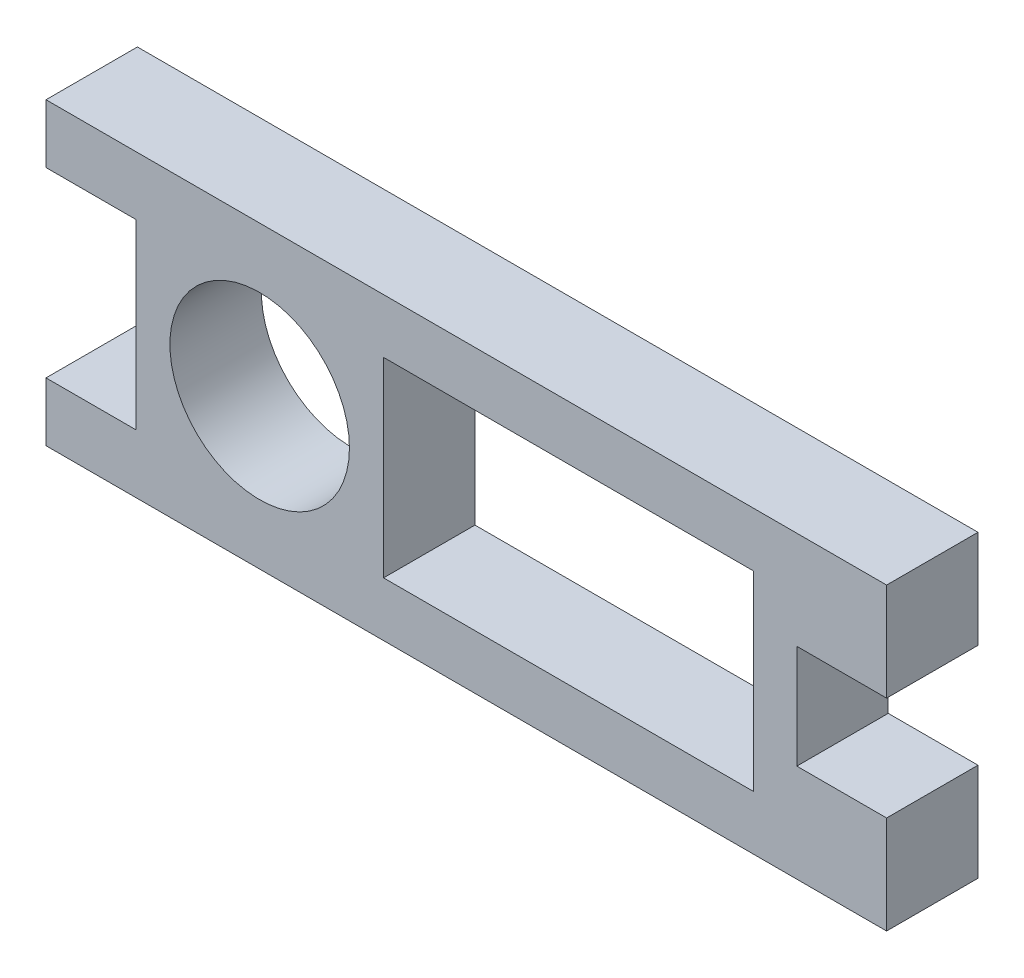
ISO-10303-21;
HEADER;
FILE_DESCRIPTION(('STEP AP214'),'2;1');
FILE_NAME('part.step','',(''),(''),'','','');
FILE_SCHEMA(('AUTOMOTIVE_DESIGN { 1 0 10303 214 1 1 1 1 }'));
ENDSEC;
DATA;
#1=APPLICATION_CONTEXT('core data for automotive mechanical design processes');
#2=APPLICATION_PROTOCOL_DEFINITION('international standard','automotive_design',2000,#1);
#3=PRODUCT_CONTEXT('',#1,'mechanical');
#4=PRODUCT('Part','Part','',(#3));
#5=PRODUCT_RELATED_PRODUCT_CATEGORY('part','',(#4));
#6=PRODUCT_DEFINITION_FORMATION('','',#4);
#7=PRODUCT_DEFINITION_CONTEXT('part definition',#1,'design');
#8=PRODUCT_DEFINITION('design','',#6,#7);
#9=PRODUCT_DEFINITION_SHAPE('','',#8);
#10=(LENGTH_UNIT() NAMED_UNIT(*) SI_UNIT(.MILLI.,.METRE.));
#11=(NAMED_UNIT(*) PLANE_ANGLE_UNIT() SI_UNIT($,.RADIAN.));
#12=(NAMED_UNIT(*) SI_UNIT($,.STERADIAN.) SOLID_ANGLE_UNIT());
#13=UNCERTAINTY_MEASURE_WITH_UNIT(LENGTH_MEASURE(1.E-05),#10,'distance_accuracy_value','');
#14=(GEOMETRIC_REPRESENTATION_CONTEXT(3) GLOBAL_UNCERTAINTY_ASSIGNED_CONTEXT((#13)) GLOBAL_UNIT_ASSIGNED_CONTEXT((#10,
#11,#12)) REPRESENTATION_CONTEXT('',''));
#15=CARTESIAN_POINT('',(0.,0.,0.));
#16=DIRECTION('',(0.,0.,1.));
#17=DIRECTION('',(1.,0.,0.));
#18=AXIS2_PLACEMENT_3D('',#15,#16,#17);
#19=CARTESIAN_POINT('',(0.,0.,5.6));
#20=DIRECTION('',(0.,0.,-1.));
#21=DIRECTION('',(-1.,0.,0.));
#22=AXIS2_PLACEMENT_3D('',#19,#20,#21);
#23=PLANE('',#22);
#24=DIRECTION('',(0.,-1.,0.));
#25=VECTOR('',#24,1.);
#26=CARTESIAN_POINT('',(717.471264670895,391.314983564074,5.6));
#27=LINE('',#26,#25);
#28=CARTESIAN_POINT('',(717.471264670895,403.014983564074,5.6));
#29=VERTEX_POINT('',#28);
#30=CARTESIAN_POINT('',(717.471264670895,391.314983564074,5.6));
#31=VERTEX_POINT('',#30);
#32=EDGE_CURVE('E148',#29,#31,#27,.T.);
#33=ORIENTED_EDGE('',*,*,#32,.F.);
#34=DIRECTION('',(-1.,0.,0.));
#35=VECTOR('',#34,1.);
#36=CARTESIAN_POINT('',(717.471264670895,403.014983564074,5.6));
#37=LINE('',#36,#35);
#38=CARTESIAN_POINT('',(740.140264670895,403.014983564074,5.6));
#39=VERTEX_POINT('',#38);
#40=EDGE_CURVE('E171',#39,#29,#37,.T.);
#41=ORIENTED_EDGE('',*,*,#40,.F.);
#42=DIRECTION('',(0.,1.,0.));
#43=VECTOR('',#42,1.);
#44=CARTESIAN_POINT('',(740.140264670895,391.314983564074,5.6));
#45=LINE('',#44,#43);
#46=CARTESIAN_POINT('',(740.140264670895,391.314983564074,5.6));
#47=VERTEX_POINT('',#46);
#48=EDGE_CURVE('E169',#47,#39,#45,.T.);
#49=ORIENTED_EDGE('',*,*,#48,.F.);
#50=DIRECTION('',(1.,0.,0.));
#51=VECTOR('',#50,1.);
#52=CARTESIAN_POINT('',(717.471264670895,391.314983564074,5.6));
#53=LINE('',#52,#51);
#54=EDGE_CURVE('E156',#31,#47,#53,.T.);
#55=ORIENTED_EDGE('',*,*,#54,.F.);
#56=EDGE_LOOP('',(#33,#41,#49,#55));
#57=FACE_BOUND('',#56,.T.);
#58=DIRECTION('',(1.,0.,0.));
#59=VECTOR('',#58,1.);
#60=CARTESIAN_POINT('',(702.290264670895,402.743983564074,5.6));
#61=LINE('',#60,#59);
#62=CARTESIAN_POINT('',(696.790264670895,402.743983564074,5.6));
#63=VERTEX_POINT('',#62);
#64=CARTESIAN_POINT('',(702.290264670895,402.743983564074,5.6));
#65=VERTEX_POINT('',#64);
#66=EDGE_CURVE('E187',#63,#65,#61,.T.);
#67=ORIENTED_EDGE('',*,*,#66,.T.);
#68=DIRECTION('',(0.,-1.,0.));
#69=VECTOR('',#68,1.);
#70=CARTESIAN_POINT('',(702.290264670895,402.743983564074,5.6));
#71=LINE('',#70,#69);
#72=CARTESIAN_POINT('',(702.290264670895,391.585983564074,5.6));
#73=VERTEX_POINT('',#72);
#74=EDGE_CURVE('E190',#65,#73,#71,.T.);
#75=ORIENTED_EDGE('',*,*,#74,.T.);
#76=DIRECTION('',(-1.,0.,0.));
#77=VECTOR('',#76,1.);
#78=CARTESIAN_POINT('',(696.790264670895,391.585983564074,5.6));
#79=LINE('',#78,#77);
#80=CARTESIAN_POINT('',(696.790264670895,391.585983564074,5.6));
#81=VERTEX_POINT('',#80);
#82=EDGE_CURVE('E193',#73,#81,#79,.T.);
#83=ORIENTED_EDGE('',*,*,#82,.T.);
#84=DIRECTION('',(0.,-1.,0.));
#85=VECTOR('',#84,1.);
#86=CARTESIAN_POINT('',(696.790264670895,387.985983564074,5.6));
#87=LINE('',#86,#85);
#88=CARTESIAN_POINT('',(696.790264670895,387.985983564074,5.6));
#89=VERTEX_POINT('',#88);
#90=EDGE_CURVE('E195',#81,#89,#87,.T.);
#91=ORIENTED_EDGE('',*,*,#90,.T.);
#92=DIRECTION('',(1.,0.,0.));
#93=VECTOR('',#92,1.);
#94=CARTESIAN_POINT('',(748.290264670895,387.985983564074,5.6));
#95=LINE('',#94,#93);
#96=CARTESIAN_POINT('',(748.290264670895,387.985983564074,5.6));
#97=VERTEX_POINT('',#96);
#98=EDGE_CURVE('E197',#89,#97,#95,.T.);
#99=ORIENTED_EDGE('',*,*,#98,.T.);
#100=DIRECTION('',(0.,1.,0.));
#101=VECTOR('',#100,1.);
#102=CARTESIAN_POINT('',(748.290264670895,393.985983564074,5.6));
#103=LINE('',#102,#101);
#104=CARTESIAN_POINT('',(748.290264670895,393.985983564074,5.6));
#105=VERTEX_POINT('',#104);
#106=EDGE_CURVE('E199',#97,#105,#103,.T.);
#107=ORIENTED_EDGE('',*,*,#106,.T.);
#108=DIRECTION('',(-1.,0.,0.));
#109=VECTOR('',#108,1.);
#110=CARTESIAN_POINT('',(742.790264670895,393.985983564074,5.6));
#111=LINE('',#110,#109);
#112=CARTESIAN_POINT('',(742.790264670895,393.985983564074,5.6));
#113=VERTEX_POINT('',#112);
#114=EDGE_CURVE('E201',#105,#113,#111,.T.);
#115=ORIENTED_EDGE('',*,*,#114,.T.);
#116=DIRECTION('',(0.,1.,0.));
#117=VECTOR('',#116,1.);
#118=CARTESIAN_POINT('',(742.790264670895,400.343983564074,5.6));
#119=LINE('',#118,#117);
#120=CARTESIAN_POINT('',(742.790264670895,400.343983564074,5.6));
#121=VERTEX_POINT('',#120);
#122=EDGE_CURVE('E203',#113,#121,#119,.T.);
#123=ORIENTED_EDGE('',*,*,#122,.T.);
#124=DIRECTION('',(1.,0.,0.));
#125=VECTOR('',#124,1.);
#126=CARTESIAN_POINT('',(748.290264670895,400.343983564074,5.6));
#127=LINE('',#126,#125);
#128=CARTESIAN_POINT('',(748.290264670895,400.343983564074,5.6));
#129=VERTEX_POINT('',#128);
#130=EDGE_CURVE('E205',#121,#129,#127,.T.);
#131=ORIENTED_EDGE('',*,*,#130,.T.);
#132=DIRECTION('',(0.,1.,0.));
#133=VECTOR('',#132,1.);
#134=CARTESIAN_POINT('',(748.290264670895,406.343983564074,5.6));
#135=LINE('',#134,#133);
#136=CARTESIAN_POINT('',(748.290264670895,406.343983564074,5.6));
#137=VERTEX_POINT('',#136);
#138=EDGE_CURVE('E207',#129,#137,#135,.T.);
#139=ORIENTED_EDGE('',*,*,#138,.T.);
#140=DIRECTION('',(-1.,0.,0.));
#141=VECTOR('',#140,1.);
#142=CARTESIAN_POINT('',(696.790264670895,406.343983564074,5.6));
#143=LINE('',#142,#141);
#144=CARTESIAN_POINT('',(696.790264670895,406.343983564074,5.6));
#145=VERTEX_POINT('',#144);
#146=EDGE_CURVE('E209',#137,#145,#143,.T.);
#147=ORIENTED_EDGE('',*,*,#146,.T.);
#148=DIRECTION('',(0.,-1.,0.));
#149=VECTOR('',#148,1.);
#150=CARTESIAN_POINT('',(696.790264670895,402.743983564074,5.6));
#151=LINE('',#150,#149);
#152=EDGE_CURVE('E211',#145,#63,#151,.T.);
#153=ORIENTED_EDGE('',*,*,#152,.T.);
#154=EDGE_LOOP('',(#67,#75,#83,#91,#99,#107,#115,#123,#131,#139,#147,#153));
#155=FACE_BOUND('',#154,.T.);
#156=CARTESIAN_POINT('',(709.880764670895,397.164983564074,5.6));
#157=DIRECTION('',(0.,0.,1.));
#158=DIRECTION('',(1.,0.,0.));
#159=AXIS2_PLACEMENT_3D('',#156,#157,#158);
#160=CIRCLE('',#159,5.49999999999996);
#161=CARTESIAN_POINT('',(715.380764670895,397.164983564074,5.6));
#162=VERTEX_POINT('',#161);
#163=EDGE_CURVE('E177',#162,#162,#160,.T.);
#164=ORIENTED_EDGE('',*,*,#163,.F.);
#165=EDGE_LOOP('',(#164));
#166=FACE_BOUND('',#165,.T.);
#167=ADVANCED_FACE('F35',(#57,#155,#166),#23,.F.);
#168=CARTESIAN_POINT('',(0.,0.,0.));
#169=DIRECTION('',(0.,0.,-1.));
#170=DIRECTION('',(-1.,0.,0.));
#171=AXIS2_PLACEMENT_3D('',#168,#169,#170);
#172=PLANE('',#171);
#173=DIRECTION('',(-1.,0.,0.));
#174=VECTOR('',#173,1.);
#175=CARTESIAN_POINT('',(717.471264670895,403.014983564074,0.));
#176=LINE('',#175,#174);
#177=CARTESIAN_POINT('',(740.140264670895,403.014983564074,0.));
#178=VERTEX_POINT('',#177);
#179=CARTESIAN_POINT('',(717.471264670895,403.014983564074,0.));
#180=VERTEX_POINT('',#179);
#181=EDGE_CURVE('E157',#178,#180,#176,.T.);
#182=ORIENTED_EDGE('',*,*,#181,.T.);
#183=DIRECTION('',(0.,-1.,0.));
#184=VECTOR('',#183,1.);
#185=CARTESIAN_POINT('',(717.471264670895,391.314983564074,0.));
#186=LINE('',#185,#184);
#187=CARTESIAN_POINT('',(717.471264670895,391.314983564074,0.));
#188=VERTEX_POINT('',#187);
#189=EDGE_CURVE('E58',#180,#188,#186,.T.);
#190=ORIENTED_EDGE('',*,*,#189,.T.);
#191=DIRECTION('',(1.,0.,0.));
#192=VECTOR('',#191,1.);
#193=CARTESIAN_POINT('',(717.471264670895,391.314983564074,0.));
#194=LINE('',#193,#192);
#195=CARTESIAN_POINT('',(740.140264670895,391.314983564074,0.));
#196=VERTEX_POINT('',#195);
#197=EDGE_CURVE('E163',#188,#196,#194,.T.);
#198=ORIENTED_EDGE('',*,*,#197,.T.);
#199=DIRECTION('',(0.,1.,0.));
#200=VECTOR('',#199,1.);
#201=CARTESIAN_POINT('',(740.140264670895,391.314983564074,0.));
#202=LINE('',#201,#200);
#203=EDGE_CURVE('E179',#196,#178,#202,.T.);
#204=ORIENTED_EDGE('',*,*,#203,.T.);
#205=EDGE_LOOP('',(#182,#190,#198,#204));
#206=FACE_BOUND('',#205,.T.);
#207=DIRECTION('',(1.,0.,0.));
#208=VECTOR('',#207,1.);
#209=CARTESIAN_POINT('',(702.290264670895,402.743983564074,0.));
#210=LINE('',#209,#208);
#211=CARTESIAN_POINT('',(696.790264670895,402.743983564074,0.));
#212=VERTEX_POINT('',#211);
#213=CARTESIAN_POINT('',(702.290264670895,402.743983564074,0.));
#214=VERTEX_POINT('',#213);
#215=EDGE_CURVE('E164',#212,#214,#210,.T.);
#216=ORIENTED_EDGE('',*,*,#215,.F.);
#217=DIRECTION('',(0.,-1.,0.));
#218=VECTOR('',#217,1.);
#219=CARTESIAN_POINT('',(696.790264670895,402.743983564074,0.));
#220=LINE('',#219,#218);
#221=CARTESIAN_POINT('',(696.790264670895,406.343983564074,0.));
#222=VERTEX_POINT('',#221);
#223=EDGE_CURVE('E191',#222,#212,#220,.T.);
#224=ORIENTED_EDGE('',*,*,#223,.F.);
#225=DIRECTION('',(-1.,0.,0.));
#226=VECTOR('',#225,1.);
#227=CARTESIAN_POINT('',(696.790264670895,406.343983564074,0.));
#228=LINE('',#227,#226);
#229=CARTESIAN_POINT('',(748.290264670895,406.343983564074,0.));
#230=VERTEX_POINT('',#229);
#231=EDGE_CURVE('E234',#230,#222,#228,.T.);
#232=ORIENTED_EDGE('',*,*,#231,.F.);
#233=DIRECTION('',(0.,1.,0.));
#234=VECTOR('',#233,1.);
#235=CARTESIAN_POINT('',(748.290264670895,406.343983564074,0.));
#236=LINE('',#235,#234);
#237=CARTESIAN_POINT('',(748.290264670895,400.343983564074,0.));
#238=VERTEX_POINT('',#237);
#239=EDGE_CURVE('E232',#238,#230,#236,.T.);
#240=ORIENTED_EDGE('',*,*,#239,.F.);
#241=DIRECTION('',(1.,0.,0.));
#242=VECTOR('',#241,1.);
#243=CARTESIAN_POINT('',(748.290264670895,400.343983564074,0.));
#244=LINE('',#243,#242);
#245=CARTESIAN_POINT('',(742.790264670895,400.343983564074,0.));
#246=VERTEX_POINT('',#245);
#247=EDGE_CURVE('E230',#246,#238,#244,.T.);
#248=ORIENTED_EDGE('',*,*,#247,.F.);
#249=DIRECTION('',(0.,1.,0.));
#250=VECTOR('',#249,1.);
#251=CARTESIAN_POINT('',(742.790264670895,400.343983564074,0.));
#252=LINE('',#251,#250);
#253=CARTESIAN_POINT('',(742.790264670895,393.985983564074,0.));
#254=VERTEX_POINT('',#253);
#255=EDGE_CURVE('E228',#254,#246,#252,.T.);
#256=ORIENTED_EDGE('',*,*,#255,.F.);
#257=DIRECTION('',(-1.,0.,0.));
#258=VECTOR('',#257,1.);
#259=CARTESIAN_POINT('',(742.790264670895,393.985983564074,0.));
#260=LINE('',#259,#258);
#261=CARTESIAN_POINT('',(748.290264670895,393.985983564074,0.));
#262=VERTEX_POINT('',#261);
#263=EDGE_CURVE('E226',#262,#254,#260,.T.);
#264=ORIENTED_EDGE('',*,*,#263,.F.);
#265=DIRECTION('',(0.,1.,0.));
#266=VECTOR('',#265,1.);
#267=CARTESIAN_POINT('',(748.290264670895,393.985983564074,0.));
#268=LINE('',#267,#266);
#269=CARTESIAN_POINT('',(748.290264670895,387.985983564074,0.));
#270=VERTEX_POINT('',#269);
#271=EDGE_CURVE('E224',#270,#262,#268,.T.);
#272=ORIENTED_EDGE('',*,*,#271,.F.);
#273=DIRECTION('',(1.,0.,0.));
#274=VECTOR('',#273,1.);
#275=CARTESIAN_POINT('',(748.290264670895,387.985983564074,0.));
#276=LINE('',#275,#274);
#277=CARTESIAN_POINT('',(696.790264670895,387.985983564074,0.));
#278=VERTEX_POINT('',#277);
#279=EDGE_CURVE('E222',#278,#270,#276,.T.);
#280=ORIENTED_EDGE('',*,*,#279,.F.);
#281=DIRECTION('',(0.,-1.,0.));
#282=VECTOR('',#281,1.);
#283=CARTESIAN_POINT('',(696.790264670895,387.985983564074,0.));
#284=LINE('',#283,#282);
#285=CARTESIAN_POINT('',(696.790264670895,391.585983564074,0.));
#286=VERTEX_POINT('',#285);
#287=EDGE_CURVE('E220',#286,#278,#284,.T.);
#288=ORIENTED_EDGE('',*,*,#287,.F.);
#289=DIRECTION('',(-1.,0.,0.));
#290=VECTOR('',#289,1.);
#291=CARTESIAN_POINT('',(696.790264670895,391.585983564074,0.));
#292=LINE('',#291,#290);
#293=CARTESIAN_POINT('',(702.290264670895,391.585983564074,0.));
#294=VERTEX_POINT('',#293);
#295=EDGE_CURVE('E218',#294,#286,#292,.T.);
#296=ORIENTED_EDGE('',*,*,#295,.F.);
#297=DIRECTION('',(0.,-1.,0.));
#298=VECTOR('',#297,1.);
#299=CARTESIAN_POINT('',(702.290264670895,402.743983564074,0.));
#300=LINE('',#299,#298);
#301=EDGE_CURVE('E216',#214,#294,#300,.T.);
#302=ORIENTED_EDGE('',*,*,#301,.F.);
#303=EDGE_LOOP('',(#216,#224,#232,#240,#248,#256,#264,#272,#280,#288,#296,#302));
#304=FACE_BOUND('',#303,.T.);
#305=CARTESIAN_POINT('',(709.880764670895,397.164983564074,0.));
#306=DIRECTION('',(0.,0.,1.));
#307=DIRECTION('',(1.,0.,0.));
#308=AXIS2_PLACEMENT_3D('',#305,#306,#307);
#309=CIRCLE('',#308,5.49999999999996);
#310=CARTESIAN_POINT('',(715.380764670895,397.164983564074,0.));
#311=VERTEX_POINT('',#310);
#312=EDGE_CURVE('E488',#311,#311,#309,.T.);
#313=ORIENTED_EDGE('',*,*,#312,.T.);
#314=EDGE_LOOP('',(#313));
#315=FACE_BOUND('',#314,.T.);
#316=ADVANCED_FACE('F276',(#206,#304,#315),#172,.T.);
#317=CARTESIAN_POINT('',(702.290264670895,402.743983564074,5.6));
#318=DIRECTION('',(0.,1.,0.));
#319=DIRECTION('',(0.,0.,1.));
#320=AXIS2_PLACEMENT_3D('',#317,#318,#319);
#321=PLANE('',#320);
#322=ORIENTED_EDGE('',*,*,#215,.T.);
#323=DIRECTION('',(0.,0.,-1.));
#324=VECTOR('',#323,1.);
#325=CARTESIAN_POINT('',(702.290264670895,402.743983564074,5.6));
#326=LINE('',#325,#324);
#327=EDGE_CURVE('E11',#65,#214,#326,.T.);
#328=ORIENTED_EDGE('',*,*,#327,.F.);
#329=ORIENTED_EDGE('',*,*,#66,.F.);
#330=DIRECTION('',(0.,0.,-1.));
#331=VECTOR('',#330,1.);
#332=CARTESIAN_POINT('',(696.790264670895,402.743983564074,5.6));
#333=LINE('',#332,#331);
#334=EDGE_CURVE('E213',#63,#212,#333,.T.);
#335=ORIENTED_EDGE('',*,*,#334,.T.);
#336=EDGE_LOOP('',(#322,#328,#329,#335));
#337=FACE_BOUND('',#336,.T.);
#338=ADVANCED_FACE('F37',(#337),#321,.F.);
#339=CARTESIAN_POINT('',(702.290264670895,402.743983564074,5.6));
#340=DIRECTION('',(1.,0.,0.));
#341=DIRECTION('',(0.,0.,-1.));
#342=AXIS2_PLACEMENT_3D('',#339,#340,#341);
#343=PLANE('',#342);
#344=ORIENTED_EDGE('',*,*,#301,.T.);
#345=DIRECTION('',(0.,0.,-1.));
#346=VECTOR('',#345,1.);
#347=CARTESIAN_POINT('',(702.290264670895,391.585983564074,5.6));
#348=LINE('',#347,#346);
#349=EDGE_CURVE('E43',#73,#294,#348,.T.);
#350=ORIENTED_EDGE('',*,*,#349,.F.);
#351=ORIENTED_EDGE('',*,*,#74,.F.);
#352=ORIENTED_EDGE('',*,*,#327,.T.);
#353=EDGE_LOOP('',(#344,#350,#351,#352));
#354=FACE_BOUND('',#353,.T.);
#355=ADVANCED_FACE('F293',(#354),#343,.F.);
#356=CARTESIAN_POINT('',(696.790264670895,391.585983564074,5.6));
#357=DIRECTION('',(0.,-1.,0.));
#358=DIRECTION('',(0.,0.,-1.));
#359=AXIS2_PLACEMENT_3D('',#356,#357,#358);
#360=PLANE('',#359);
#361=ORIENTED_EDGE('',*,*,#295,.T.);
#362=DIRECTION('',(0.,0.,-1.));
#363=VECTOR('',#362,1.);
#364=CARTESIAN_POINT('',(696.790264670895,391.585983564074,5.6));
#365=LINE('',#364,#363);
#366=EDGE_CURVE('E263',#81,#286,#365,.T.);
#367=ORIENTED_EDGE('',*,*,#366,.F.);
#368=ORIENTED_EDGE('',*,*,#82,.F.);
#369=ORIENTED_EDGE('',*,*,#349,.T.);
#370=EDGE_LOOP('',(#361,#367,#368,#369));
#371=FACE_BOUND('',#370,.T.);
#372=ADVANCED_FACE('F270',(#371),#360,.F.);
#373=CARTESIAN_POINT('',(696.790264670895,387.985983564074,5.6));
#374=DIRECTION('',(1.,0.,0.));
#375=DIRECTION('',(0.,1.,0.));
#376=AXIS2_PLACEMENT_3D('',#373,#374,#375);
#377=PLANE('',#376);
#378=ORIENTED_EDGE('',*,*,#287,.T.);
#379=DIRECTION('',(0.,0.,-1.));
#380=VECTOR('',#379,1.);
#381=CARTESIAN_POINT('',(696.790264670895,387.985983564074,5.6));
#382=LINE('',#381,#380);
#383=EDGE_CURVE('E260',#89,#278,#382,.T.);
#384=ORIENTED_EDGE('',*,*,#383,.F.);
#385=ORIENTED_EDGE('',*,*,#90,.F.);
#386=ORIENTED_EDGE('',*,*,#366,.T.);
#387=EDGE_LOOP('',(#378,#384,#385,#386));
#388=FACE_BOUND('',#387,.T.);
#389=ADVANCED_FACE('F282',(#388),#377,.F.);
#390=CARTESIAN_POINT('',(748.290264670895,387.985983564074,5.6));
#391=DIRECTION('',(0.,1.,0.));
#392=DIRECTION('',(0.,0.,1.));
#393=AXIS2_PLACEMENT_3D('',#390,#391,#392);
#394=PLANE('',#393);
#395=ORIENTED_EDGE('',*,*,#279,.T.);
#396=DIRECTION('',(0.,0.,-1.));
#397=VECTOR('',#396,1.);
#398=CARTESIAN_POINT('',(748.290264670895,387.985983564074,5.6));
#399=LINE('',#398,#397);
#400=EDGE_CURVE('E257',#97,#270,#399,.T.);
#401=ORIENTED_EDGE('',*,*,#400,.F.);
#402=ORIENTED_EDGE('',*,*,#98,.F.);
#403=ORIENTED_EDGE('',*,*,#383,.T.);
#404=EDGE_LOOP('',(#395,#401,#402,#403));
#405=FACE_BOUND('',#404,.T.);
#406=ADVANCED_FACE('F286',(#405),#394,.F.);
#407=CARTESIAN_POINT('',(748.290264670895,393.985983564074,5.6));
#408=DIRECTION('',(-1.,0.,0.));
#409=DIRECTION('',(0.,0.,1.));
#410=AXIS2_PLACEMENT_3D('',#407,#408,#409);
#411=PLANE('',#410);
#412=ORIENTED_EDGE('',*,*,#271,.T.);
#413=DIRECTION('',(0.,0.,-1.));
#414=VECTOR('',#413,1.);
#415=CARTESIAN_POINT('',(748.290264670895,393.985983564074,5.6));
#416=LINE('',#415,#414);
#417=EDGE_CURVE('E254',#105,#262,#416,.T.);
#418=ORIENTED_EDGE('',*,*,#417,.F.);
#419=ORIENTED_EDGE('',*,*,#106,.F.);
#420=ORIENTED_EDGE('',*,*,#400,.T.);
#421=EDGE_LOOP('',(#412,#418,#419,#420));
#422=FACE_BOUND('',#421,.T.);
#423=ADVANCED_FACE('F326',(#422),#411,.F.);
#424=CARTESIAN_POINT('',(742.790264670895,393.985983564074,5.6));
#425=DIRECTION('',(0.,-1.,0.));
#426=DIRECTION('',(0.,0.,-1.));
#427=AXIS2_PLACEMENT_3D('',#424,#425,#426);
#428=PLANE('',#427);
#429=ORIENTED_EDGE('',*,*,#263,.T.);
#430=DIRECTION('',(0.,0.,-1.));
#431=VECTOR('',#430,1.);
#432=CARTESIAN_POINT('',(742.790264670895,393.985983564074,5.6));
#433=LINE('',#432,#431);
#434=EDGE_CURVE('E251',#113,#254,#433,.T.);
#435=ORIENTED_EDGE('',*,*,#434,.F.);
#436=ORIENTED_EDGE('',*,*,#114,.F.);
#437=ORIENTED_EDGE('',*,*,#417,.T.);
#438=EDGE_LOOP('',(#429,#435,#436,#437));
#439=FACE_BOUND('',#438,.T.);
#440=ADVANCED_FACE('F324',(#439),#428,.F.);
#441=CARTESIAN_POINT('',(742.790264670895,400.343983564074,5.6));
#442=DIRECTION('',(-1.,0.,0.));
#443=DIRECTION('',(0.,0.,1.));
#444=AXIS2_PLACEMENT_3D('',#441,#442,#443);
#445=PLANE('',#444);
#446=ORIENTED_EDGE('',*,*,#255,.T.);
#447=DIRECTION('',(0.,0.,-1.));
#448=VECTOR('',#447,1.);
#449=CARTESIAN_POINT('',(742.790264670895,400.343983564074,5.6));
#450=LINE('',#449,#448);
#451=EDGE_CURVE('E248',#121,#246,#450,.T.);
#452=ORIENTED_EDGE('',*,*,#451,.F.);
#453=ORIENTED_EDGE('',*,*,#122,.F.);
#454=ORIENTED_EDGE('',*,*,#434,.T.);
#455=EDGE_LOOP('',(#446,#452,#453,#454));
#456=FACE_BOUND('',#455,.T.);
#457=ADVANCED_FACE('F320',(#456),#445,.F.);
#458=CARTESIAN_POINT('',(748.290264670895,400.343983564074,5.6));
#459=DIRECTION('',(0.,1.,0.));
#460=DIRECTION('',(0.,0.,1.));
#461=AXIS2_PLACEMENT_3D('',#458,#459,#460);
#462=PLANE('',#461);
#463=ORIENTED_EDGE('',*,*,#247,.T.);
#464=DIRECTION('',(0.,0.,-1.));
#465=VECTOR('',#464,1.);
#466=CARTESIAN_POINT('',(748.290264670895,400.343983564074,5.6));
#467=LINE('',#466,#465);
#468=EDGE_CURVE('E245',#129,#238,#467,.T.);
#469=ORIENTED_EDGE('',*,*,#468,.F.);
#470=ORIENTED_EDGE('',*,*,#130,.F.);
#471=ORIENTED_EDGE('',*,*,#451,.T.);
#472=EDGE_LOOP('',(#463,#469,#470,#471));
#473=FACE_BOUND('',#472,.T.);
#474=ADVANCED_FACE('F315',(#473),#462,.F.);
#475=CARTESIAN_POINT('',(748.290264670895,406.343983564074,5.6));
#476=DIRECTION('',(-1.,0.,0.));
#477=DIRECTION('',(0.,0.,1.));
#478=AXIS2_PLACEMENT_3D('',#475,#476,#477);
#479=PLANE('',#478);
#480=ORIENTED_EDGE('',*,*,#239,.T.);
#481=DIRECTION('',(0.,0.,-1.));
#482=VECTOR('',#481,1.);
#483=CARTESIAN_POINT('',(748.290264670895,406.343983564074,5.6));
#484=LINE('',#483,#482);
#485=EDGE_CURVE('E242',#137,#230,#484,.T.);
#486=ORIENTED_EDGE('',*,*,#485,.F.);
#487=ORIENTED_EDGE('',*,*,#138,.F.);
#488=ORIENTED_EDGE('',*,*,#468,.T.);
#489=EDGE_LOOP('',(#480,#486,#487,#488));
#490=FACE_BOUND('',#489,.T.);
#491=ADVANCED_FACE('F309',(#490),#479,.F.);
#492=CARTESIAN_POINT('',(696.790264670895,406.343983564074,5.6));
#493=DIRECTION('',(0.,-1.,0.));
#494=DIRECTION('',(0.,0.,-1.));
#495=AXIS2_PLACEMENT_3D('',#492,#493,#494);
#496=PLANE('',#495);
#497=ORIENTED_EDGE('',*,*,#231,.T.);
#498=DIRECTION('',(0.,0.,-1.));
#499=VECTOR('',#498,1.);
#500=CARTESIAN_POINT('',(696.790264670895,406.343983564074,5.6));
#501=LINE('',#500,#499);
#502=EDGE_CURVE('E239',#145,#222,#501,.T.);
#503=ORIENTED_EDGE('',*,*,#502,.F.);
#504=ORIENTED_EDGE('',*,*,#146,.F.);
#505=ORIENTED_EDGE('',*,*,#485,.T.);
#506=EDGE_LOOP('',(#497,#503,#504,#505));
#507=FACE_BOUND('',#506,.T.);
#508=ADVANCED_FACE('F305',(#507),#496,.F.);
#509=CARTESIAN_POINT('',(696.790264670895,402.743983564074,5.6));
#510=DIRECTION('',(1.,0.,0.));
#511=DIRECTION('',(0.,1.,0.));
#512=AXIS2_PLACEMENT_3D('',#509,#510,#511);
#513=PLANE('',#512);
#514=ORIENTED_EDGE('',*,*,#223,.T.);
#515=ORIENTED_EDGE('',*,*,#334,.F.);
#516=ORIENTED_EDGE('',*,*,#152,.F.);
#517=ORIENTED_EDGE('',*,*,#502,.T.);
#518=EDGE_LOOP('',(#514,#515,#516,#517));
#519=FACE_BOUND('',#518,.T.);
#520=ADVANCED_FACE('F300',(#519),#513,.F.);
#521=CARTESIAN_POINT('',(717.471264670895,391.314983564074,5.6));
#522=DIRECTION('',(1.,0.,0.));
#523=DIRECTION('',(0.,0.,-1.));
#524=AXIS2_PLACEMENT_3D('',#521,#522,#523);
#525=PLANE('',#524);
#526=ORIENTED_EDGE('',*,*,#189,.F.);
#527=DIRECTION('',(0.,0.,-1.));
#528=VECTOR('',#527,1.);
#529=CARTESIAN_POINT('',(717.471264670895,403.014983564074,5.6));
#530=LINE('',#529,#528);
#531=EDGE_CURVE('E152',#29,#180,#530,.T.);
#532=ORIENTED_EDGE('',*,*,#531,.F.);
#533=ORIENTED_EDGE('',*,*,#32,.T.);
#534=DIRECTION('',(0.,0.,-1.));
#535=VECTOR('',#534,1.);
#536=CARTESIAN_POINT('',(717.471264670895,391.314983564074,5.6));
#537=LINE('',#536,#535);
#538=EDGE_CURVE('E151',#31,#188,#537,.T.);
#539=ORIENTED_EDGE('',*,*,#538,.T.);
#540=EDGE_LOOP('',(#526,#532,#533,#539));
#541=FACE_BOUND('',#540,.T.);
#542=ADVANCED_FACE('F150',(#541),#525,.T.);
#543=CARTESIAN_POINT('',(717.471264670895,391.314983564074,5.6));
#544=DIRECTION('',(0.,1.,0.));
#545=DIRECTION('',(0.,0.,1.));
#546=AXIS2_PLACEMENT_3D('',#543,#544,#545);
#547=PLANE('',#546);
#548=ORIENTED_EDGE('',*,*,#197,.F.);
#549=ORIENTED_EDGE('',*,*,#538,.F.);
#550=ORIENTED_EDGE('',*,*,#54,.T.);
#551=DIRECTION('',(0.,0.,-1.));
#552=VECTOR('',#551,1.);
#553=CARTESIAN_POINT('',(740.140264670895,391.314983564074,5.6));
#554=LINE('',#553,#552);
#555=EDGE_CURVE('E165',#47,#196,#554,.T.);
#556=ORIENTED_EDGE('',*,*,#555,.T.);
#557=EDGE_LOOP('',(#548,#549,#550,#556));
#558=FACE_BOUND('',#557,.T.);
#559=ADVANCED_FACE('F160',(#558),#547,.T.);
#560=CARTESIAN_POINT('',(740.140264670895,391.314983564074,5.6));
#561=DIRECTION('',(-1.,0.,0.));
#562=DIRECTION('',(0.,0.,1.));
#563=AXIS2_PLACEMENT_3D('',#560,#561,#562);
#564=PLANE('',#563);
#565=ORIENTED_EDGE('',*,*,#203,.F.);
#566=ORIENTED_EDGE('',*,*,#555,.F.);
#567=ORIENTED_EDGE('',*,*,#48,.T.);
#568=DIRECTION('',(0.,0.,-1.));
#569=VECTOR('',#568,1.);
#570=CARTESIAN_POINT('',(740.140264670895,403.014983564074,5.6));
#571=LINE('',#570,#569);
#572=EDGE_CURVE('E50',#39,#178,#571,.T.);
#573=ORIENTED_EDGE('',*,*,#572,.T.);
#574=EDGE_LOOP('',(#565,#566,#567,#573));
#575=FACE_BOUND('',#574,.T.);
#576=ADVANCED_FACE('F385',(#575),#564,.T.);
#577=CARTESIAN_POINT('',(717.471264670895,403.014983564074,5.6));
#578=DIRECTION('',(0.,-1.,0.));
#579=DIRECTION('',(0.,0.,-1.));
#580=AXIS2_PLACEMENT_3D('',#577,#578,#579);
#581=PLANE('',#580);
#582=ORIENTED_EDGE('',*,*,#181,.F.);
#583=ORIENTED_EDGE('',*,*,#572,.F.);
#584=ORIENTED_EDGE('',*,*,#40,.T.);
#585=ORIENTED_EDGE('',*,*,#531,.T.);
#586=EDGE_LOOP('',(#582,#583,#584,#585));
#587=FACE_BOUND('',#586,.T.);
#588=ADVANCED_FACE('F391',(#587),#581,.T.);
#589=CARTESIAN_POINT('',(709.880764670895,397.164983564074,5.6));
#590=DIRECTION('',(0.,0.,-1.));
#591=DIRECTION('',(-1.,0.,0.));
#592=AXIS2_PLACEMENT_3D('',#589,#590,#591);
#593=CYLINDRICAL_SURFACE('',#592,5.49999999999996);
#594=ORIENTED_EDGE('',*,*,#163,.T.);
#595=EDGE_LOOP('',(#594));
#596=FACE_BOUND('',#595,.T.);
#597=ORIENTED_EDGE('',*,*,#312,.F.);
#598=EDGE_LOOP('',(#597));
#599=FACE_BOUND('',#598,.T.);
#600=ADVANCED_FACE('F399',(#596,#599),#593,.F.);
#601=CLOSED_SHELL('',(#167,#316,#338,#355,#372,#389,#406,#423,#440,#457,#474,#491,#508,#520,
#542,#559,#576,#588,#600));
#602=MANIFOLD_SOLID_BREP('B2',#601);
#603=ADVANCED_BREP_SHAPE_REPRESENTATION('',(#18,#602),#14);
#604=SHAPE_DEFINITION_REPRESENTATION(#9,#603);
ENDSEC;
END-ISO-10303-21;
